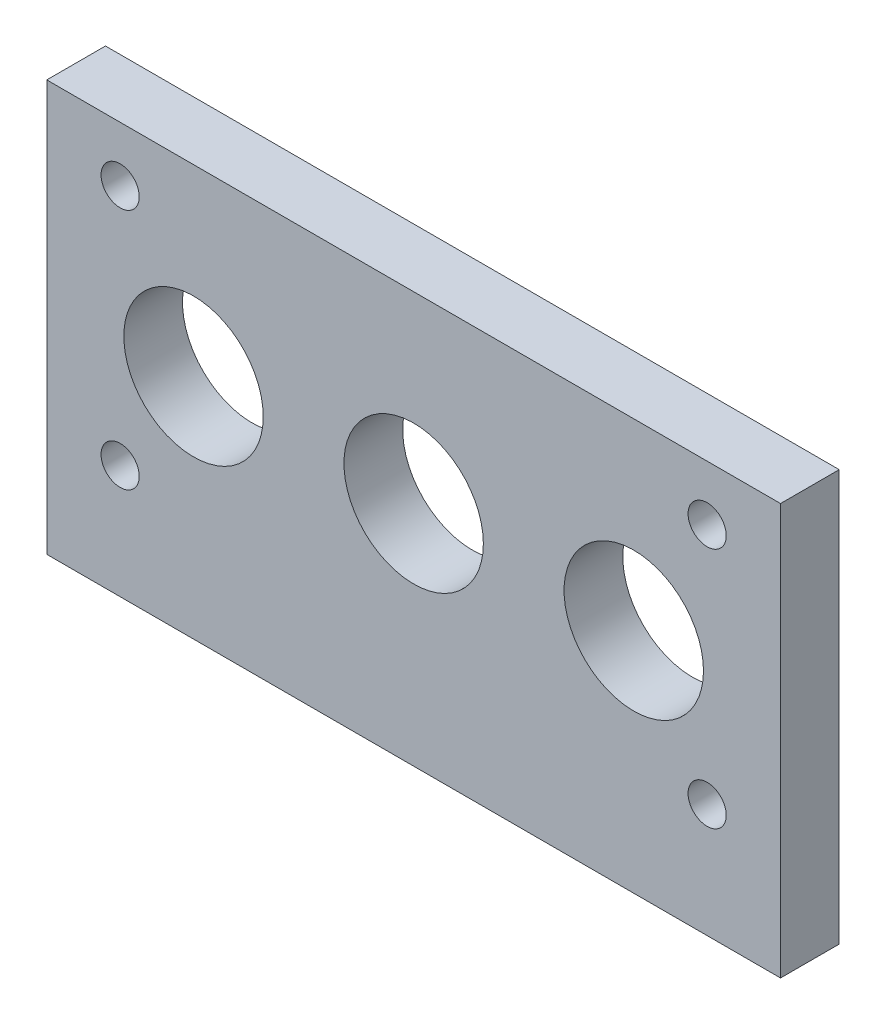
ISO-10303-21;
HEADER;
FILE_DESCRIPTION(('STEP AP214'),'2;1');
FILE_NAME('part.step','',(''),(''),'','','');
FILE_SCHEMA(('AUTOMOTIVE_DESIGN { 1 0 10303 214 1 1 1 1 }'));
ENDSEC;
DATA;
#1=APPLICATION_CONTEXT('core data for automotive mechanical design processes');
#2=APPLICATION_PROTOCOL_DEFINITION('international standard','automotive_design',2000,#1);
#3=PRODUCT_CONTEXT('',#1,'mechanical');
#4=PRODUCT('Part','Part','',(#3));
#5=PRODUCT_RELATED_PRODUCT_CATEGORY('part','',(#4));
#6=PRODUCT_DEFINITION_FORMATION('','',#4);
#7=PRODUCT_DEFINITION_CONTEXT('part definition',#1,'design');
#8=PRODUCT_DEFINITION('design','',#6,#7);
#9=PRODUCT_DEFINITION_SHAPE('','',#8);
#10=(LENGTH_UNIT() NAMED_UNIT(*) SI_UNIT(.MILLI.,.METRE.));
#11=(NAMED_UNIT(*) PLANE_ANGLE_UNIT() SI_UNIT($,.RADIAN.));
#12=(NAMED_UNIT(*) SI_UNIT($,.STERADIAN.) SOLID_ANGLE_UNIT());
#13=UNCERTAINTY_MEASURE_WITH_UNIT(LENGTH_MEASURE(1.E-05),#10,'distance_accuracy_value','');
#14=(GEOMETRIC_REPRESENTATION_CONTEXT(3) GLOBAL_UNCERTAINTY_ASSIGNED_CONTEXT((#13)) GLOBAL_UNIT_ASSIGNED_CONTEXT((#10,
#11,#12)) REPRESENTATION_CONTEXT('',''));
#15=CARTESIAN_POINT('',(0.,0.,0.));
#16=DIRECTION('',(0.,0.,1.));
#17=DIRECTION('',(1.,0.,0.));
#18=AXIS2_PLACEMENT_3D('',#15,#16,#17);
#19=CARTESIAN_POINT('',(0.,0.,8.));
#20=DIRECTION('',(0.,0.,1.));
#21=DIRECTION('',(1.,0.,0.));
#22=AXIS2_PLACEMENT_3D('',#19,#20,#21);
#23=PLANE('',#22);
#24=CARTESIAN_POINT('',(-42.0310531512819,20.7576866764275,8.));
#25=DIRECTION('',(0.,0.,1.));
#26=DIRECTION('',(1.,0.,0.));
#27=AXIS2_PLACEMENT_3D('',#24,#25,#26);
#28=CIRCLE('',#27,2.59999999999999);
#29=CARTESIAN_POINT('',(-39.431053151282,20.7576866764275,8.));
#30=VERTEX_POINT('',#29);
#31=EDGE_CURVE('E127',#30,#30,#28,.T.);
#32=ORIENTED_EDGE('',*,*,#31,.F.);
#33=EDGE_LOOP('',(#32));
#34=FACE_BOUND('',#33,.T.);
#35=CARTESIAN_POINT('',(-42.0310531512819,-12.2423133235725,8.));
#36=DIRECTION('',(0.,0.,1.));
#37=DIRECTION('',(1.,0.,0.));
#38=AXIS2_PLACEMENT_3D('',#35,#36,#37);
#39=CIRCLE('',#38,2.59999999999999);
#40=CARTESIAN_POINT('',(-39.431053151282,-12.2423133235725,8.));
#41=VERTEX_POINT('',#40);
#42=EDGE_CURVE('E132',#41,#41,#39,.T.);
#43=ORIENTED_EDGE('',*,*,#42,.F.);
#44=EDGE_LOOP('',(#43));
#45=FACE_BOUND('',#44,.T.);
#46=CARTESIAN_POINT('',(37.9689468487181,-12.2423133235725,8.));
#47=DIRECTION('',(0.,0.,1.));
#48=DIRECTION('',(1.,0.,0.));
#49=AXIS2_PLACEMENT_3D('',#46,#47,#48);
#50=CIRCLE('',#49,2.59999999999999);
#51=CARTESIAN_POINT('',(40.5689468487181,-12.2423133235725,8.));
#52=VERTEX_POINT('',#51);
#53=EDGE_CURVE('E135',#52,#52,#50,.T.);
#54=ORIENTED_EDGE('',*,*,#53,.F.);
#55=EDGE_LOOP('',(#54));
#56=FACE_BOUND('',#55,.T.);
#57=CARTESIAN_POINT('',(37.9689468487181,20.7576866764275,8.));
#58=DIRECTION('',(0.,0.,1.));
#59=DIRECTION('',(1.,0.,0.));
#60=AXIS2_PLACEMENT_3D('',#57,#58,#59);
#61=CIRCLE('',#60,2.59999999999999);
#62=CARTESIAN_POINT('',(40.5689468487181,20.7576866764275,8.));
#63=VERTEX_POINT('',#62);
#64=EDGE_CURVE('E138',#63,#63,#61,.T.);
#65=ORIENTED_EDGE('',*,*,#64,.F.);
#66=EDGE_LOOP('',(#65));
#67=FACE_BOUND('',#66,.T.);
#68=CARTESIAN_POINT('',(27.9689468487181,3.25768667642752,8.));
#69=DIRECTION('',(0.,0.,1.));
#70=DIRECTION('',(1.,0.,0.));
#71=AXIS2_PLACEMENT_3D('',#68,#69,#70);
#72=CIRCLE('',#71,9.5);
#73=CARTESIAN_POINT('',(37.4689468487181,3.25768667642752,8.));
#74=VERTEX_POINT('',#73);
#75=EDGE_CURVE('E115',#74,#74,#72,.T.);
#76=ORIENTED_EDGE('',*,*,#75,.F.);
#77=EDGE_LOOP('',(#76));
#78=FACE_BOUND('',#77,.T.);
#79=DIRECTION('',(0.,-1.,0.));
#80=VECTOR('',#79,1.);
#81=CARTESIAN_POINT('',(-52.0310531512819,28.2576866764275,8.));
#82=LINE('',#81,#80);
#83=CARTESIAN_POINT('',(-52.0310531512819,28.2576866764275,8.));
#84=VERTEX_POINT('',#83);
#85=CARTESIAN_POINT('',(-52.0310531512819,-27.7423133235725,8.));
#86=VERTEX_POINT('',#85);
#87=EDGE_CURVE('E85',#84,#86,#82,.T.);
#88=ORIENTED_EDGE('',*,*,#87,.T.);
#89=DIRECTION('',(1.,0.,0.));
#90=VECTOR('',#89,1.);
#91=CARTESIAN_POINT('',(-52.0310531512819,-27.7423133235725,8.));
#92=LINE('',#91,#90);
#93=CARTESIAN_POINT('',(47.9689468487181,-27.7423133235725,8.));
#94=VERTEX_POINT('',#93);
#95=EDGE_CURVE('E80',#86,#94,#92,.T.);
#96=ORIENTED_EDGE('',*,*,#95,.T.);
#97=DIRECTION('',(0.,1.,0.));
#98=VECTOR('',#97,1.);
#99=CARTESIAN_POINT('',(47.9689468487181,28.2576866764275,8.));
#100=LINE('',#99,#98);
#101=CARTESIAN_POINT('',(47.9689468487181,28.2576866764275,8.));
#102=VERTEX_POINT('',#101);
#103=EDGE_CURVE('E83',#94,#102,#100,.T.);
#104=ORIENTED_EDGE('',*,*,#103,.T.);
#105=DIRECTION('',(-1.,0.,0.));
#106=VECTOR('',#105,1.);
#107=CARTESIAN_POINT('',(-52.0310531512819,28.2576866764275,8.));
#108=LINE('',#107,#106);
#109=EDGE_CURVE('E50',#102,#84,#108,.T.);
#110=ORIENTED_EDGE('',*,*,#109,.T.);
#111=EDGE_LOOP('',(#88,#96,#104,#110));
#112=FACE_BOUND('',#111,.T.);
#113=CARTESIAN_POINT('',(-32.031053151282,3.25768667642752,8.));
#114=DIRECTION('',(0.,0.,1.));
#115=DIRECTION('',(1.,0.,0.));
#116=AXIS2_PLACEMENT_3D('',#113,#114,#115);
#117=CIRCLE('',#116,9.50000000000001);
#118=CARTESIAN_POINT('',(-22.5310531512819,3.25768667642752,8.));
#119=VERTEX_POINT('',#118);
#120=EDGE_CURVE('E100',#119,#119,#117,.T.);
#121=ORIENTED_EDGE('',*,*,#120,.F.);
#122=EDGE_LOOP('',(#121));
#123=FACE_BOUND('',#122,.T.);
#124=CARTESIAN_POINT('',(-2.03105315128194,3.25768667642752,8.));
#125=DIRECTION('',(0.,0.,1.));
#126=DIRECTION('',(1.,0.,0.));
#127=AXIS2_PLACEMENT_3D('',#124,#125,#126);
#128=CIRCLE('',#127,9.5);
#129=CARTESIAN_POINT('',(7.46894684871806,3.25768667642752,8.));
#130=VERTEX_POINT('',#129);
#131=EDGE_CURVE('E121',#130,#130,#128,.T.);
#132=ORIENTED_EDGE('',*,*,#131,.F.);
#133=EDGE_LOOP('',(#132));
#134=FACE_BOUND('',#133,.T.);
#135=ADVANCED_FACE('F33',(#34,#45,#56,#67,#78,#112,#123,#134),#23,.T.);
#136=CARTESIAN_POINT('',(0.,0.,0.));
#137=DIRECTION('',(0.,0.,1.));
#138=DIRECTION('',(1.,0.,0.));
#139=AXIS2_PLACEMENT_3D('',#136,#137,#138);
#140=PLANE('',#139);
#141=CARTESIAN_POINT('',(-42.0310531512819,20.7576866764275,0.));
#142=DIRECTION('',(0.,0.,-1.));
#143=DIRECTION('',(-1.,0.,0.));
#144=AXIS2_PLACEMENT_3D('',#141,#142,#143);
#145=CIRCLE('',#144,2.59999999999999);
#146=CARTESIAN_POINT('',(-44.6310531512819,20.7576866764275,0.));
#147=VERTEX_POINT('',#146);
#148=EDGE_CURVE('E145',#147,#147,#145,.T.);
#149=ORIENTED_EDGE('',*,*,#148,.F.);
#150=EDGE_LOOP('',(#149));
#151=FACE_BOUND('',#150,.T.);
#152=CARTESIAN_POINT('',(-42.0310531512819,-12.2423133235725,0.));
#153=DIRECTION('',(0.,0.,-1.));
#154=DIRECTION('',(-1.,0.,0.));
#155=AXIS2_PLACEMENT_3D('',#152,#153,#154);
#156=CIRCLE('',#155,2.59999999999999);
#157=CARTESIAN_POINT('',(-44.6310531512819,-12.2423133235725,0.));
#158=VERTEX_POINT('',#157);
#159=EDGE_CURVE('E148',#158,#158,#156,.T.);
#160=ORIENTED_EDGE('',*,*,#159,.F.);
#161=EDGE_LOOP('',(#160));
#162=FACE_BOUND('',#161,.T.);
#163=CARTESIAN_POINT('',(37.9689468487181,-12.2423133235725,0.));
#164=DIRECTION('',(0.,0.,-1.));
#165=DIRECTION('',(-1.,0.,0.));
#166=AXIS2_PLACEMENT_3D('',#163,#164,#165);
#167=CIRCLE('',#166,2.59999999999999);
#168=CARTESIAN_POINT('',(35.3689468487181,-12.2423133235725,0.));
#169=VERTEX_POINT('',#168);
#170=EDGE_CURVE('E144',#169,#169,#167,.T.);
#171=ORIENTED_EDGE('',*,*,#170,.F.);
#172=EDGE_LOOP('',(#171));
#173=FACE_BOUND('',#172,.T.);
#174=CARTESIAN_POINT('',(37.9689468487181,20.7576866764275,0.));
#175=DIRECTION('',(0.,0.,-1.));
#176=DIRECTION('',(-1.,0.,0.));
#177=AXIS2_PLACEMENT_3D('',#174,#175,#176);
#178=CIRCLE('',#177,2.59999999999999);
#179=CARTESIAN_POINT('',(35.3689468487181,20.7576866764275,0.));
#180=VERTEX_POINT('',#179);
#181=EDGE_CURVE('E141',#180,#180,#178,.T.);
#182=ORIENTED_EDGE('',*,*,#181,.F.);
#183=EDGE_LOOP('',(#182));
#184=FACE_BOUND('',#183,.T.);
#185=DIRECTION('',(0.,-1.,0.));
#186=VECTOR('',#185,1.);
#187=CARTESIAN_POINT('',(-52.0310531512819,28.2576866764275,0.));
#188=LINE('',#187,#186);
#189=CARTESIAN_POINT('',(-52.0310531512819,28.2576866764275,0.));
#190=VERTEX_POINT('',#189);
#191=CARTESIAN_POINT('',(-52.0310531512819,-27.7423133235725,0.));
#192=VERTEX_POINT('',#191);
#193=EDGE_CURVE('E97',#190,#192,#188,.T.);
#194=ORIENTED_EDGE('',*,*,#193,.F.);
#195=DIRECTION('',(-1.,0.,0.));
#196=VECTOR('',#195,1.);
#197=CARTESIAN_POINT('',(-52.0310531512819,28.2576866764275,0.));
#198=LINE('',#197,#196);
#199=CARTESIAN_POINT('',(47.9689468487181,28.2576866764275,0.));
#200=VERTEX_POINT('',#199);
#201=EDGE_CURVE('E73',#200,#190,#198,.T.);
#202=ORIENTED_EDGE('',*,*,#201,.F.);
#203=DIRECTION('',(0.,1.,0.));
#204=VECTOR('',#203,1.);
#205=CARTESIAN_POINT('',(47.9689468487181,28.2576866764275,0.));
#206=LINE('',#205,#204);
#207=CARTESIAN_POINT('',(47.9689468487181,-27.7423133235725,0.));
#208=VERTEX_POINT('',#207);
#209=EDGE_CURVE('E67',#208,#200,#206,.T.);
#210=ORIENTED_EDGE('',*,*,#209,.F.);
#211=DIRECTION('',(1.,0.,0.));
#212=VECTOR('',#211,1.);
#213=CARTESIAN_POINT('',(-52.0310531512819,-27.7423133235725,0.));
#214=LINE('',#213,#212);
#215=EDGE_CURVE('E89',#192,#208,#214,.T.);
#216=ORIENTED_EDGE('',*,*,#215,.F.);
#217=EDGE_LOOP('',(#194,#202,#210,#216));
#218=FACE_BOUND('',#217,.T.);
#219=CARTESIAN_POINT('',(-32.031053151282,3.25768667642752,0.));
#220=DIRECTION('',(0.,0.,1.));
#221=DIRECTION('',(1.,0.,0.));
#222=AXIS2_PLACEMENT_3D('',#219,#220,#221);
#223=CIRCLE('',#222,9.50000000000001);
#224=CARTESIAN_POINT('',(-22.5310531512819,3.25768667642752,0.));
#225=VERTEX_POINT('',#224);
#226=EDGE_CURVE('E112',#225,#225,#223,.T.);
#227=ORIENTED_EDGE('',*,*,#226,.T.);
#228=EDGE_LOOP('',(#227));
#229=FACE_BOUND('',#228,.T.);
#230=CARTESIAN_POINT('',(27.9689468487181,3.25768667642752,0.));
#231=DIRECTION('',(0.,0.,1.));
#232=DIRECTION('',(1.,0.,0.));
#233=AXIS2_PLACEMENT_3D('',#230,#231,#232);
#234=CIRCLE('',#233,9.5);
#235=CARTESIAN_POINT('',(37.4689468487181,3.25768667642752,0.));
#236=VERTEX_POINT('',#235);
#237=EDGE_CURVE('E118',#236,#236,#234,.T.);
#238=ORIENTED_EDGE('',*,*,#237,.T.);
#239=EDGE_LOOP('',(#238));
#240=FACE_BOUND('',#239,.T.);
#241=CARTESIAN_POINT('',(-2.03105315128194,3.25768667642752,0.));
#242=DIRECTION('',(0.,0.,1.));
#243=DIRECTION('',(1.,0.,0.));
#244=AXIS2_PLACEMENT_3D('',#241,#242,#243);
#245=CIRCLE('',#244,9.5);
#246=CARTESIAN_POINT('',(7.46894684871806,3.25768667642752,0.));
#247=VERTEX_POINT('',#246);
#248=EDGE_CURVE('E124',#247,#247,#245,.T.);
#249=ORIENTED_EDGE('',*,*,#248,.T.);
#250=EDGE_LOOP('',(#249));
#251=FACE_BOUND('',#250,.T.);
#252=ADVANCED_FACE('F108',(#151,#162,#173,#184,#218,#229,#240,#251),#140,.F.);
#253=CARTESIAN_POINT('',(-52.0310531512819,28.2576866764275,8.));
#254=DIRECTION('',(1.,0.,0.));
#255=DIRECTION('',(0.,0.,-1.));
#256=AXIS2_PLACEMENT_3D('',#253,#254,#255);
#257=PLANE('',#256);
#258=ORIENTED_EDGE('',*,*,#193,.T.);
#259=DIRECTION('',(0.,0.,-1.));
#260=VECTOR('',#259,1.);
#261=CARTESIAN_POINT('',(-52.0310531512819,-27.7423133235725,8.));
#262=LINE('',#261,#260);
#263=EDGE_CURVE('E11',#86,#192,#262,.T.);
#264=ORIENTED_EDGE('',*,*,#263,.F.);
#265=ORIENTED_EDGE('',*,*,#87,.F.);
#266=DIRECTION('',(0.,0.,-1.));
#267=VECTOR('',#266,1.);
#268=CARTESIAN_POINT('',(-52.0310531512819,28.2576866764275,8.));
#269=LINE('',#268,#267);
#270=EDGE_CURVE('E93',#84,#190,#269,.T.);
#271=ORIENTED_EDGE('',*,*,#270,.T.);
#272=EDGE_LOOP('',(#258,#264,#265,#271));
#273=FACE_BOUND('',#272,.T.);
#274=ADVANCED_FACE('F35',(#273),#257,.F.);
#275=CARTESIAN_POINT('',(-52.0310531512819,-27.7423133235725,8.));
#276=DIRECTION('',(0.,1.,0.));
#277=DIRECTION('',(0.,0.,1.));
#278=AXIS2_PLACEMENT_3D('',#275,#276,#277);
#279=PLANE('',#278);
#280=ORIENTED_EDGE('',*,*,#215,.T.);
#281=DIRECTION('',(0.,0.,-1.));
#282=VECTOR('',#281,1.);
#283=CARTESIAN_POINT('',(47.9689468487181,-27.7423133235725,8.));
#284=LINE('',#283,#282);
#285=EDGE_CURVE('E42',#94,#208,#284,.T.);
#286=ORIENTED_EDGE('',*,*,#285,.F.);
#287=ORIENTED_EDGE('',*,*,#95,.F.);
#288=ORIENTED_EDGE('',*,*,#263,.T.);
#289=EDGE_LOOP('',(#280,#286,#287,#288));
#290=FACE_BOUND('',#289,.T.);
#291=ADVANCED_FACE('F88',(#290),#279,.F.);
#292=CARTESIAN_POINT('',(47.9689468487181,28.2576866764275,8.));
#293=DIRECTION('',(-1.,0.,0.));
#294=DIRECTION('',(0.,-1.,0.));
#295=AXIS2_PLACEMENT_3D('',#292,#293,#294);
#296=PLANE('',#295);
#297=ORIENTED_EDGE('',*,*,#209,.T.);
#298=DIRECTION('',(0.,0.,-1.));
#299=VECTOR('',#298,1.);
#300=CARTESIAN_POINT('',(47.9689468487181,28.2576866764275,8.));
#301=LINE('',#300,#299);
#302=EDGE_CURVE('E90',#102,#200,#301,.T.);
#303=ORIENTED_EDGE('',*,*,#302,.F.);
#304=ORIENTED_EDGE('',*,*,#103,.F.);
#305=ORIENTED_EDGE('',*,*,#285,.T.);
#306=EDGE_LOOP('',(#297,#303,#304,#305));
#307=FACE_BOUND('',#306,.T.);
#308=ADVANCED_FACE('F91',(#307),#296,.F.);
#309=CARTESIAN_POINT('',(-52.0310531512819,28.2576866764275,8.));
#310=DIRECTION('',(0.,-1.,0.));
#311=DIRECTION('',(0.,0.,-1.));
#312=AXIS2_PLACEMENT_3D('',#309,#310,#311);
#313=PLANE('',#312);
#314=ORIENTED_EDGE('',*,*,#201,.T.);
#315=ORIENTED_EDGE('',*,*,#270,.F.);
#316=ORIENTED_EDGE('',*,*,#109,.F.);
#317=ORIENTED_EDGE('',*,*,#302,.T.);
#318=EDGE_LOOP('',(#314,#315,#316,#317));
#319=FACE_BOUND('',#318,.T.);
#320=ADVANCED_FACE('F105',(#319),#313,.F.);
#321=CARTESIAN_POINT('',(-32.031053151282,3.25768667642752,8.));
#322=DIRECTION('',(0.,0.,-1.));
#323=DIRECTION('',(-1.,0.,0.));
#324=AXIS2_PLACEMENT_3D('',#321,#322,#323);
#325=CYLINDRICAL_SURFACE('',#324,9.50000000000001);
#326=ORIENTED_EDGE('',*,*,#120,.T.);
#327=EDGE_LOOP('',(#326));
#328=FACE_BOUND('',#327,.T.);
#329=ORIENTED_EDGE('',*,*,#226,.F.);
#330=EDGE_LOOP('',(#329));
#331=FACE_BOUND('',#330,.T.);
#332=ADVANCED_FACE('F187',(#328,#331),#325,.F.);
#333=CARTESIAN_POINT('',(27.9689468487181,3.25768667642752,8.));
#334=DIRECTION('',(0.,0.,-1.));
#335=DIRECTION('',(-1.,0.,0.));
#336=AXIS2_PLACEMENT_3D('',#333,#334,#335);
#337=CYLINDRICAL_SURFACE('',#336,9.5);
#338=ORIENTED_EDGE('',*,*,#75,.T.);
#339=EDGE_LOOP('',(#338));
#340=FACE_BOUND('',#339,.T.);
#341=ORIENTED_EDGE('',*,*,#237,.F.);
#342=EDGE_LOOP('',(#341));
#343=FACE_BOUND('',#342,.T.);
#344=ADVANCED_FACE('F174',(#340,#343),#337,.F.);
#345=CARTESIAN_POINT('',(-2.03105315128194,3.25768667642752,8.));
#346=DIRECTION('',(0.,0.,-1.));
#347=DIRECTION('',(-1.,0.,0.));
#348=AXIS2_PLACEMENT_3D('',#345,#346,#347);
#349=CYLINDRICAL_SURFACE('',#348,9.5);
#350=ORIENTED_EDGE('',*,*,#131,.T.);
#351=EDGE_LOOP('',(#350));
#352=FACE_BOUND('',#351,.T.);
#353=ORIENTED_EDGE('',*,*,#248,.F.);
#354=EDGE_LOOP('',(#353));
#355=FACE_BOUND('',#354,.T.);
#356=ADVANCED_FACE('F164',(#352,#355),#349,.F.);
#357=CARTESIAN_POINT('',(37.9689468487181,20.7576866764275,10.));
#358=DIRECTION('',(0.,0.,-1.));
#359=DIRECTION('',(-1.,0.,0.));
#360=AXIS2_PLACEMENT_3D('',#357,#358,#359);
#361=CYLINDRICAL_SURFACE('',#360,2.59999999999999);
#362=ORIENTED_EDGE('',*,*,#64,.T.);
#363=EDGE_LOOP('',(#362));
#364=FACE_BOUND('',#363,.T.);
#365=ORIENTED_EDGE('',*,*,#181,.T.);
#366=EDGE_LOOP('',(#365));
#367=FACE_BOUND('',#366,.T.);
#368=ADVANCED_FACE('F162',(#364,#367),#361,.F.);
#369=CARTESIAN_POINT('',(37.9689468487181,-12.2423133235725,10.));
#370=DIRECTION('',(0.,0.,-1.));
#371=DIRECTION('',(-1.,0.,0.));
#372=AXIS2_PLACEMENT_3D('',#369,#370,#371);
#373=CYLINDRICAL_SURFACE('',#372,2.59999999999999);
#374=ORIENTED_EDGE('',*,*,#53,.T.);
#375=EDGE_LOOP('',(#374));
#376=FACE_BOUND('',#375,.T.);
#377=ORIENTED_EDGE('',*,*,#170,.T.);
#378=EDGE_LOOP('',(#377));
#379=FACE_BOUND('',#378,.T.);
#380=ADVANCED_FACE('F154',(#376,#379),#373,.F.);
#381=CARTESIAN_POINT('',(-42.0310531512819,-12.2423133235725,10.));
#382=DIRECTION('',(0.,0.,-1.));
#383=DIRECTION('',(-1.,0.,0.));
#384=AXIS2_PLACEMENT_3D('',#381,#382,#383);
#385=CYLINDRICAL_SURFACE('',#384,2.59999999999999);
#386=ORIENTED_EDGE('',*,*,#42,.T.);
#387=EDGE_LOOP('',(#386));
#388=FACE_BOUND('',#387,.T.);
#389=ORIENTED_EDGE('',*,*,#159,.T.);
#390=EDGE_LOOP('',(#389));
#391=FACE_BOUND('',#390,.T.);
#392=ADVANCED_FACE('F171',(#388,#391),#385,.F.);
#393=CARTESIAN_POINT('',(-42.0310531512819,20.7576866764275,10.));
#394=DIRECTION('',(0.,0.,-1.));
#395=DIRECTION('',(-1.,0.,0.));
#396=AXIS2_PLACEMENT_3D('',#393,#394,#395);
#397=CYLINDRICAL_SURFACE('',#396,2.59999999999999);
#398=ORIENTED_EDGE('',*,*,#31,.T.);
#399=EDGE_LOOP('',(#398));
#400=FACE_BOUND('',#399,.T.);
#401=ORIENTED_EDGE('',*,*,#148,.T.);
#402=EDGE_LOOP('',(#401));
#403=FACE_BOUND('',#402,.T.);
#404=ADVANCED_FACE('F227',(#400,#403),#397,.F.);
#405=CLOSED_SHELL('',(#135,#252,#274,#291,#308,#320,#332,#344,#356,#368,#380,#392,#404));
#406=MANIFOLD_SOLID_BREP('B2',#405);
#407=ADVANCED_BREP_SHAPE_REPRESENTATION('',(#18,#406),#14);
#408=SHAPE_DEFINITION_REPRESENTATION(#9,#407);
ENDSEC;
END-ISO-10303-21;
